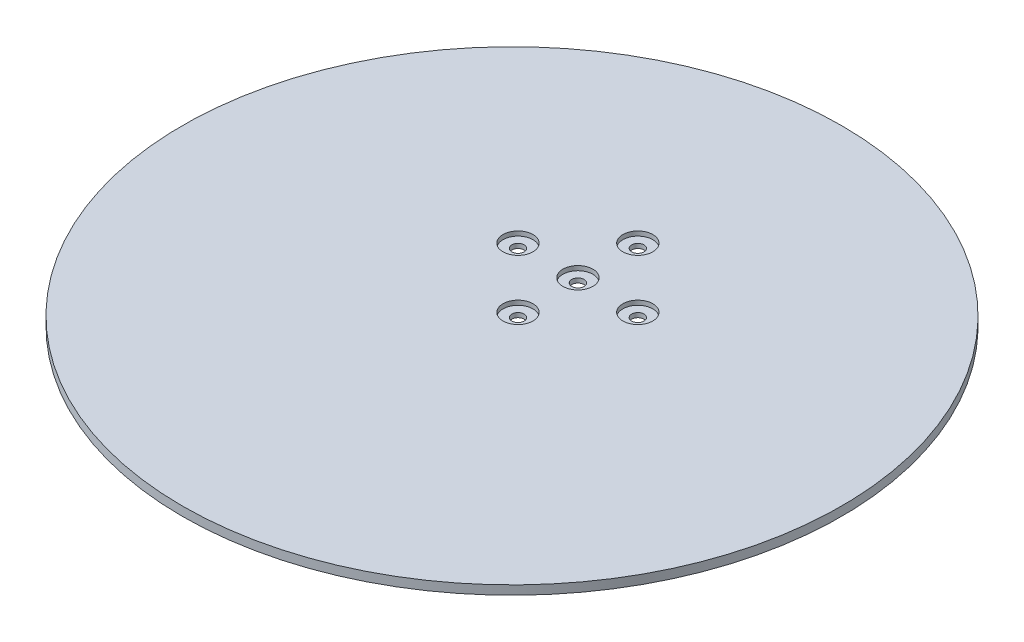
ISO-10303-21;
HEADER;
FILE_DESCRIPTION(('STEP AP214'),'2;1');
FILE_NAME('part.step','',(''),(''),'','','');
FILE_SCHEMA(('AUTOMOTIVE_DESIGN { 1 0 10303 214 1 1 1 1 }'));
ENDSEC;
DATA;
#1=APPLICATION_CONTEXT('core data for automotive mechanical design processes');
#2=APPLICATION_PROTOCOL_DEFINITION('international standard','automotive_design',2000,#1);
#3=PRODUCT_CONTEXT('',#1,'mechanical');
#4=PRODUCT('Part','Part','',(#3));
#5=PRODUCT_RELATED_PRODUCT_CATEGORY('part','',(#4));
#6=PRODUCT_DEFINITION_FORMATION('','',#4);
#7=PRODUCT_DEFINITION_CONTEXT('part definition',#1,'design');
#8=PRODUCT_DEFINITION('design','',#6,#7);
#9=PRODUCT_DEFINITION_SHAPE('','',#8);
#10=(LENGTH_UNIT() NAMED_UNIT(*) SI_UNIT(.MILLI.,.METRE.));
#11=(NAMED_UNIT(*) PLANE_ANGLE_UNIT() SI_UNIT($,.RADIAN.));
#12=(NAMED_UNIT(*) SI_UNIT($,.STERADIAN.) SOLID_ANGLE_UNIT());
#13=UNCERTAINTY_MEASURE_WITH_UNIT(LENGTH_MEASURE(1.E-05),#10,'distance_accuracy_value','');
#14=(GEOMETRIC_REPRESENTATION_CONTEXT(3) GLOBAL_UNCERTAINTY_ASSIGNED_CONTEXT((#13)) GLOBAL_UNIT_ASSIGNED_CONTEXT((#10,
#11,#12)) REPRESENTATION_CONTEXT('',''));
#15=CARTESIAN_POINT('',(0.,0.,0.));
#16=DIRECTION('',(0.,0.,1.));
#17=DIRECTION('',(1.,0.,0.));
#18=AXIS2_PLACEMENT_3D('',#15,#16,#17);
#19=CARTESIAN_POINT('',(-1.61653377487451E-13,0.,-22.));
#20=DIRECTION('',(0.,1.,0.));
#21=DIRECTION('',(0.,0.,1.));
#22=AXIS2_PLACEMENT_3D('',#19,#20,#21);
#23=CYLINDRICAL_SURFACE('',#22,2.04999999999999);
#24=CARTESIAN_POINT('',(-1.61653377487451E-13,0.,-22.));
#25=DIRECTION('',(0.,1.,0.));
#26=DIRECTION('',(0.,0.,1.));
#27=AXIS2_PLACEMENT_3D('',#24,#25,#26);
#28=CIRCLE('',#27,2.04999999999999);
#29=CARTESIAN_POINT('',(-1.61653377487451E-13,0.,-19.95));
#30=VERTEX_POINT('',#29);
#31=EDGE_CURVE('E52',#30,#30,#28,.T.);
#32=ORIENTED_EDGE('',*,*,#31,.F.);
#33=EDGE_LOOP('',(#32));
#34=FACE_BOUND('',#33,.T.);
#35=CARTESIAN_POINT('',(-1.61653377487451E-13,1.5,-22.));
#36=DIRECTION('',(0.,1.,0.));
#37=DIRECTION('',(0.,0.,1.));
#38=AXIS2_PLACEMENT_3D('',#35,#36,#37);
#39=CIRCLE('',#38,2.04999999999999);
#40=CARTESIAN_POINT('',(-1.61653377487451E-13,1.5,-19.95));
#41=VERTEX_POINT('',#40);
#42=EDGE_CURVE('E41',#41,#41,#39,.F.);
#43=ORIENTED_EDGE('',*,*,#42,.F.);
#44=EDGE_LOOP('',(#43));
#45=FACE_BOUND('',#44,.T.);
#46=ADVANCED_FACE('F37',(#34,#45),#23,.F.);
#47=CARTESIAN_POINT('',(-20.0000000000002,0.,-22.));
#48=DIRECTION('',(0.,1.,0.));
#49=DIRECTION('',(0.,0.,1.));
#50=AXIS2_PLACEMENT_3D('',#47,#48,#49);
#51=CYLINDRICAL_SURFACE('',#50,2.05000000000001);
#52=CARTESIAN_POINT('',(-20.0000000000002,0.,-22.));
#53=DIRECTION('',(0.,1.,0.));
#54=DIRECTION('',(0.,0.,1.));
#55=AXIS2_PLACEMENT_3D('',#52,#53,#54);
#56=CIRCLE('',#55,2.05000000000001);
#57=CARTESIAN_POINT('',(-20.0000000000002,0.,-19.95));
#58=VERTEX_POINT('',#57);
#59=EDGE_CURVE('E76',#58,#58,#56,.T.);
#60=ORIENTED_EDGE('',*,*,#59,.F.);
#61=EDGE_LOOP('',(#60));
#62=FACE_BOUND('',#61,.T.);
#63=CARTESIAN_POINT('',(-20.0000000000002,1.5,-22.));
#64=DIRECTION('',(0.,1.,0.));
#65=DIRECTION('',(0.,0.,1.));
#66=AXIS2_PLACEMENT_3D('',#63,#64,#65);
#67=CIRCLE('',#66,2.05000000000001);
#68=CARTESIAN_POINT('',(-20.0000000000002,1.5,-19.95));
#69=VERTEX_POINT('',#68);
#70=EDGE_CURVE('E69',#69,#69,#67,.F.);
#71=ORIENTED_EDGE('',*,*,#70,.F.);
#72=EDGE_LOOP('',(#71));
#73=FACE_BOUND('',#72,.T.);
#74=ADVANCED_FACE('F128',(#62,#73),#51,.F.);
#75=CARTESIAN_POINT('',(-1.53461104505471E-13,0.,-2.));
#76=DIRECTION('',(0.,1.,0.));
#77=DIRECTION('',(0.,0.,1.));
#78=AXIS2_PLACEMENT_3D('',#75,#76,#77);
#79=CYLINDRICAL_SURFACE('',#78,2.05000000000001);
#80=CARTESIAN_POINT('',(-1.53461104505471E-13,0.,-2.));
#81=DIRECTION('',(0.,1.,0.));
#82=DIRECTION('',(0.,0.,1.));
#83=AXIS2_PLACEMENT_3D('',#80,#81,#82);
#84=CIRCLE('',#83,2.05000000000001);
#85=CARTESIAN_POINT('',(-1.53461104505471E-13,0.,0.0500000000000127));
#86=VERTEX_POINT('',#85);
#87=EDGE_CURVE('E81',#86,#86,#84,.T.);
#88=ORIENTED_EDGE('',*,*,#87,.F.);
#89=EDGE_LOOP('',(#88));
#90=FACE_BOUND('',#89,.T.);
#91=CARTESIAN_POINT('',(-1.53461104505471E-13,1.5,-2.));
#92=DIRECTION('',(0.,1.,0.));
#93=DIRECTION('',(0.,0.,1.));
#94=AXIS2_PLACEMENT_3D('',#91,#92,#93);
#95=CIRCLE('',#94,2.05000000000001);
#96=CARTESIAN_POINT('',(-1.53461104505471E-13,1.5,0.0500000000000127));
#97=VERTEX_POINT('',#96);
#98=EDGE_CURVE('E66',#97,#97,#95,.F.);
#99=ORIENTED_EDGE('',*,*,#98,.F.);
#100=EDGE_LOOP('',(#99));
#101=FACE_BOUND('',#100,.T.);
#102=ADVANCED_FACE('F105',(#90,#101),#79,.F.);
#103=CARTESIAN_POINT('',(19.9999999999998,0.,-22.));
#104=DIRECTION('',(0.,1.,0.));
#105=DIRECTION('',(0.,0.,1.));
#106=AXIS2_PLACEMENT_3D('',#103,#104,#105);
#107=CYLINDRICAL_SURFACE('',#106,2.04999999999999);
#108=CARTESIAN_POINT('',(19.9999999999998,0.,-22.));
#109=DIRECTION('',(0.,1.,0.));
#110=DIRECTION('',(0.,0.,1.));
#111=AXIS2_PLACEMENT_3D('',#108,#109,#110);
#112=CIRCLE('',#111,2.04999999999999);
#113=CARTESIAN_POINT('',(19.9999999999998,0.,-19.95));
#114=VERTEX_POINT('',#113);
#115=EDGE_CURVE('E87',#114,#114,#112,.T.);
#116=ORIENTED_EDGE('',*,*,#115,.F.);
#117=EDGE_LOOP('',(#116));
#118=FACE_BOUND('',#117,.T.);
#119=CARTESIAN_POINT('',(19.9999999999998,1.5,-22.));
#120=DIRECTION('',(0.,1.,0.));
#121=DIRECTION('',(0.,0.,1.));
#122=AXIS2_PLACEMENT_3D('',#119,#120,#121);
#123=CIRCLE('',#122,2.04999999999999);
#124=CARTESIAN_POINT('',(19.9999999999998,1.5,-19.95));
#125=VERTEX_POINT('',#124);
#126=EDGE_CURVE('E61',#125,#125,#123,.F.);
#127=ORIENTED_EDGE('',*,*,#126,.F.);
#128=EDGE_LOOP('',(#127));
#129=FACE_BOUND('',#128,.T.);
#130=ADVANCED_FACE('F101',(#118,#129),#107,.F.);
#131=CARTESIAN_POINT('',(-1.59204083889156E-13,0.,-42.));
#132=DIRECTION('',(0.,1.,0.));
#133=DIRECTION('',(0.,0.,1.));
#134=AXIS2_PLACEMENT_3D('',#131,#132,#133);
#135=CYLINDRICAL_SURFACE('',#134,2.04999999999999);
#136=CARTESIAN_POINT('',(-1.59204083889156E-13,0.,-42.));
#137=DIRECTION('',(0.,1.,0.));
#138=DIRECTION('',(0.,0.,1.));
#139=AXIS2_PLACEMENT_3D('',#136,#137,#138);
#140=CIRCLE('',#139,2.04999999999999);
#141=CARTESIAN_POINT('',(-1.59204083889156E-13,0.,-39.95));
#142=VERTEX_POINT('',#141);
#143=EDGE_CURVE('E91',#142,#142,#140,.T.);
#144=ORIENTED_EDGE('',*,*,#143,.F.);
#145=EDGE_LOOP('',(#144));
#146=FACE_BOUND('',#145,.T.);
#147=CARTESIAN_POINT('',(-1.59204083889156E-13,1.5,-42.));
#148=DIRECTION('',(0.,1.,0.));
#149=DIRECTION('',(0.,0.,1.));
#150=AXIS2_PLACEMENT_3D('',#147,#148,#149);
#151=CIRCLE('',#150,2.04999999999999);
#152=CARTESIAN_POINT('',(-1.59204083889156E-13,1.5,-39.95));
#153=VERTEX_POINT('',#152);
#154=EDGE_CURVE('E57',#153,#153,#151,.F.);
#155=ORIENTED_EDGE('',*,*,#154,.F.);
#156=EDGE_LOOP('',(#155));
#157=FACE_BOUND('',#156,.T.);
#158=ADVANCED_FACE('F104',(#146,#157),#135,.F.);
#159=CARTESIAN_POINT('',(0.,3.,0.));
#160=DIRECTION('',(0.,-1.,0.));
#161=DIRECTION('',(0.,0.,-1.));
#162=AXIS2_PLACEMENT_3D('',#159,#160,#161);
#163=CYLINDRICAL_SURFACE('',#162,110.);
#164=CARTESIAN_POINT('',(0.,3.,0.));
#165=DIRECTION('',(0.,1.,0.));
#166=DIRECTION('',(0.,0.,1.));
#167=AXIS2_PLACEMENT_3D('',#164,#165,#166);
#168=CIRCLE('',#167,110.);
#169=CARTESIAN_POINT('',(0.,3.,110.));
#170=VERTEX_POINT('',#169);
#171=EDGE_CURVE('E10',#170,#170,#168,.T.);
#172=ORIENTED_EDGE('',*,*,#171,.F.);
#173=EDGE_LOOP('',(#172));
#174=FACE_BOUND('',#173,.T.);
#175=CARTESIAN_POINT('',(0.,0.,0.));
#176=DIRECTION('',(0.,1.,0.));
#177=DIRECTION('',(0.,0.,1.));
#178=AXIS2_PLACEMENT_3D('',#175,#176,#177);
#179=CIRCLE('',#178,110.);
#180=CARTESIAN_POINT('',(0.,0.,110.));
#181=VERTEX_POINT('',#180);
#182=EDGE_CURVE('E46',#181,#181,#179,.T.);
#183=ORIENTED_EDGE('',*,*,#182,.T.);
#184=EDGE_LOOP('',(#183));
#185=FACE_BOUND('',#184,.T.);
#186=ADVANCED_FACE('F39',(#174,#185),#163,.T.);
#187=CARTESIAN_POINT('',(0.,3.,0.));
#188=DIRECTION('',(0.,1.,0.));
#189=DIRECTION('',(0.,0.,1.));
#190=AXIS2_PLACEMENT_3D('',#187,#188,#189);
#191=PLANE('',#190);
#192=CARTESIAN_POINT('',(19.9999999999998,3.,-22.));
#193=DIRECTION('',(0.,1.,0.));
#194=DIRECTION('',(0.,0.,1.));
#195=AXIS2_PLACEMENT_3D('',#192,#193,#194);
#196=CIRCLE('',#195,5.);
#197=CARTESIAN_POINT('',(19.9999999999998,3.,-17.));
#198=VERTEX_POINT('',#197);
#199=EDGE_CURVE('E195',#198,#198,#196,.T.);
#200=ORIENTED_EDGE('',*,*,#199,.F.);
#201=EDGE_LOOP('',(#200));
#202=FACE_BOUND('',#201,.T.);
#203=CARTESIAN_POINT('',(-1.59204083889156E-13,3.,-42.));
#204=DIRECTION('',(0.,1.,0.));
#205=DIRECTION('',(0.,0.,1.));
#206=AXIS2_PLACEMENT_3D('',#203,#204,#205);
#207=CIRCLE('',#206,5.00000000000001);
#208=CARTESIAN_POINT('',(-1.59204083889156E-13,3.,-37.));
#209=VERTEX_POINT('',#208);
#210=EDGE_CURVE('E186',#209,#209,#207,.T.);
#211=ORIENTED_EDGE('',*,*,#210,.F.);
#212=EDGE_LOOP('',(#211));
#213=FACE_BOUND('',#212,.T.);
#214=CARTESIAN_POINT('',(-1.53461104505471E-13,3.,-2.));
#215=DIRECTION('',(0.,1.,0.));
#216=DIRECTION('',(0.,0.,1.));
#217=AXIS2_PLACEMENT_3D('',#214,#215,#216);
#218=CIRCLE('',#217,5.00000000000001);
#219=CARTESIAN_POINT('',(-1.53461104505471E-13,3.,3.00000000000001));
#220=VERTEX_POINT('',#219);
#221=EDGE_CURVE('E209',#220,#220,#218,.T.);
#222=ORIENTED_EDGE('',*,*,#221,.F.);
#223=EDGE_LOOP('',(#222));
#224=FACE_BOUND('',#223,.T.);
#225=CARTESIAN_POINT('',(-20.0000000000002,3.,-22.));
#226=DIRECTION('',(0.,1.,0.));
#227=DIRECTION('',(0.,0.,1.));
#228=AXIS2_PLACEMENT_3D('',#225,#226,#227);
#229=CIRCLE('',#228,5.);
#230=CARTESIAN_POINT('',(-20.0000000000002,3.,-17.));
#231=VERTEX_POINT('',#230);
#232=EDGE_CURVE('E201',#231,#231,#229,.T.);
#233=ORIENTED_EDGE('',*,*,#232,.F.);
#234=EDGE_LOOP('',(#233));
#235=FACE_BOUND('',#234,.T.);
#236=CARTESIAN_POINT('',(-1.61653377487451E-13,3.,-22.));
#237=DIRECTION('',(0.,1.,0.));
#238=DIRECTION('',(0.,0.,1.));
#239=AXIS2_PLACEMENT_3D('',#236,#237,#238);
#240=CIRCLE('',#239,5.00000000000001);
#241=CARTESIAN_POINT('',(-1.61653377487451E-13,3.,-17.));
#242=VERTEX_POINT('',#241);
#243=EDGE_CURVE('E180',#242,#242,#240,.T.);
#244=ORIENTED_EDGE('',*,*,#243,.F.);
#245=EDGE_LOOP('',(#244));
#246=FACE_BOUND('',#245,.T.);
#247=ORIENTED_EDGE('',*,*,#171,.T.);
#248=EDGE_LOOP('',(#247));
#249=FACE_BOUND('',#248,.T.);
#250=ADVANCED_FACE('F140',(#202,#213,#224,#235,#246,#249),#191,.T.);
#251=CARTESIAN_POINT('',(0.,0.,0.));
#252=DIRECTION('',(0.,1.,0.));
#253=DIRECTION('',(0.,0.,1.));
#254=AXIS2_PLACEMENT_3D('',#251,#252,#253);
#255=PLANE('',#254);
#256=ORIENTED_EDGE('',*,*,#143,.T.);
#257=EDGE_LOOP('',(#256));
#258=FACE_BOUND('',#257,.T.);
#259=ORIENTED_EDGE('',*,*,#115,.T.);
#260=EDGE_LOOP('',(#259));
#261=FACE_BOUND('',#260,.T.);
#262=ORIENTED_EDGE('',*,*,#87,.T.);
#263=EDGE_LOOP('',(#262));
#264=FACE_BOUND('',#263,.T.);
#265=ORIENTED_EDGE('',*,*,#59,.T.);
#266=EDGE_LOOP('',(#265));
#267=FACE_BOUND('',#266,.T.);
#268=ORIENTED_EDGE('',*,*,#31,.T.);
#269=EDGE_LOOP('',(#268));
#270=FACE_BOUND('',#269,.T.);
#271=ORIENTED_EDGE('',*,*,#182,.F.);
#272=EDGE_LOOP('',(#271));
#273=FACE_BOUND('',#272,.T.);
#274=ADVANCED_FACE('F98',(#258,#261,#264,#267,#270,#273),#255,.F.);
#275=CARTESIAN_POINT('',(-1.59204083889156E-13,1.5,-42.));
#276=DIRECTION('',(0.,1.,0.));
#277=DIRECTION('',(0.,0.,1.));
#278=AXIS2_PLACEMENT_3D('',#275,#276,#277);
#279=PLANE('',#278);
#280=CARTESIAN_POINT('',(-1.59204083889156E-13,1.5,-42.));
#281=DIRECTION('',(0.,1.,0.));
#282=DIRECTION('',(0.,0.,1.));
#283=AXIS2_PLACEMENT_3D('',#280,#281,#282);
#284=CIRCLE('',#283,5.00000000000001);
#285=CARTESIAN_POINT('',(-1.59204083889156E-13,1.5,-37.));
#286=VERTEX_POINT('',#285);
#287=EDGE_CURVE('E190',#286,#286,#284,.T.);
#288=ORIENTED_EDGE('',*,*,#287,.T.);
#289=EDGE_LOOP('',(#288));
#290=FACE_BOUND('',#289,.T.);
#291=ORIENTED_EDGE('',*,*,#154,.T.);
#292=EDGE_LOOP('',(#291));
#293=FACE_BOUND('',#292,.T.);
#294=ADVANCED_FACE('F122',(#290,#293),#279,.T.);
#295=CARTESIAN_POINT('',(-1.59204083889156E-13,1.5,-42.));
#296=DIRECTION('',(0.,1.,0.));
#297=DIRECTION('',(0.,0.,1.));
#298=AXIS2_PLACEMENT_3D('',#295,#296,#297);
#299=CYLINDRICAL_SURFACE('',#298,5.00000000000001);
#300=ORIENTED_EDGE('',*,*,#287,.F.);
#301=EDGE_LOOP('',(#300));
#302=FACE_BOUND('',#301,.T.);
#303=ORIENTED_EDGE('',*,*,#210,.T.);
#304=EDGE_LOOP('',(#303));
#305=FACE_BOUND('',#304,.T.);
#306=ADVANCED_FACE('F112',(#302,#305),#299,.F.);
#307=CARTESIAN_POINT('',(19.9999999999998,1.5,-22.));
#308=DIRECTION('',(0.,1.,0.));
#309=DIRECTION('',(0.,0.,1.));
#310=AXIS2_PLACEMENT_3D('',#307,#308,#309);
#311=PLANE('',#310);
#312=CARTESIAN_POINT('',(19.9999999999998,1.5,-22.));
#313=DIRECTION('',(0.,1.,0.));
#314=DIRECTION('',(0.,0.,1.));
#315=AXIS2_PLACEMENT_3D('',#312,#313,#314);
#316=CIRCLE('',#315,5.);
#317=CARTESIAN_POINT('',(19.9999999999998,1.5,-17.));
#318=VERTEX_POINT('',#317);
#319=EDGE_CURVE('E184',#318,#318,#316,.T.);
#320=ORIENTED_EDGE('',*,*,#319,.T.);
#321=EDGE_LOOP('',(#320));
#322=FACE_BOUND('',#321,.T.);
#323=ORIENTED_EDGE('',*,*,#126,.T.);
#324=EDGE_LOOP('',(#323));
#325=FACE_BOUND('',#324,.T.);
#326=ADVANCED_FACE('F109',(#322,#325),#311,.T.);
#327=CARTESIAN_POINT('',(19.9999999999998,1.5,-22.));
#328=DIRECTION('',(0.,1.,0.));
#329=DIRECTION('',(0.,0.,1.));
#330=AXIS2_PLACEMENT_3D('',#327,#328,#329);
#331=CYLINDRICAL_SURFACE('',#330,5.);
#332=ORIENTED_EDGE('',*,*,#319,.F.);
#333=EDGE_LOOP('',(#332));
#334=FACE_BOUND('',#333,.T.);
#335=ORIENTED_EDGE('',*,*,#199,.T.);
#336=EDGE_LOOP('',(#335));
#337=FACE_BOUND('',#336,.T.);
#338=ADVANCED_FACE('F111',(#334,#337),#331,.F.);
#339=CARTESIAN_POINT('',(-1.53461104505471E-13,1.5,-2.));
#340=DIRECTION('',(0.,1.,0.));
#341=DIRECTION('',(0.,0.,1.));
#342=AXIS2_PLACEMENT_3D('',#339,#340,#341);
#343=PLANE('',#342);
#344=CARTESIAN_POINT('',(-1.53461104505471E-13,1.5,-2.));
#345=DIRECTION('',(0.,1.,0.));
#346=DIRECTION('',(0.,0.,1.));
#347=AXIS2_PLACEMENT_3D('',#344,#345,#346);
#348=CIRCLE('',#347,5.00000000000001);
#349=CARTESIAN_POINT('',(-1.53461104505471E-13,1.5,3.00000000000001));
#350=VERTEX_POINT('',#349);
#351=EDGE_CURVE('E191',#350,#350,#348,.T.);
#352=ORIENTED_EDGE('',*,*,#351,.T.);
#353=EDGE_LOOP('',(#352));
#354=FACE_BOUND('',#353,.T.);
#355=ORIENTED_EDGE('',*,*,#98,.T.);
#356=EDGE_LOOP('',(#355));
#357=FACE_BOUND('',#356,.T.);
#358=ADVANCED_FACE('F119',(#354,#357),#343,.T.);
#359=CARTESIAN_POINT('',(-1.53461104505471E-13,1.5,-2.));
#360=DIRECTION('',(0.,1.,0.));
#361=DIRECTION('',(0.,0.,1.));
#362=AXIS2_PLACEMENT_3D('',#359,#360,#361);
#363=CYLINDRICAL_SURFACE('',#362,5.00000000000001);
#364=ORIENTED_EDGE('',*,*,#351,.F.);
#365=EDGE_LOOP('',(#364));
#366=FACE_BOUND('',#365,.T.);
#367=ORIENTED_EDGE('',*,*,#221,.T.);
#368=EDGE_LOOP('',(#367));
#369=FACE_BOUND('',#368,.T.);
#370=ADVANCED_FACE('F219',(#366,#369),#363,.F.);
#371=CARTESIAN_POINT('',(-20.0000000000002,1.5,-22.));
#372=DIRECTION('',(0.,1.,0.));
#373=DIRECTION('',(0.,0.,1.));
#374=AXIS2_PLACEMENT_3D('',#371,#372,#373);
#375=PLANE('',#374);
#376=CARTESIAN_POINT('',(-20.0000000000002,1.5,-22.));
#377=DIRECTION('',(0.,1.,0.));
#378=DIRECTION('',(0.,0.,1.));
#379=AXIS2_PLACEMENT_3D('',#376,#377,#378);
#380=CIRCLE('',#379,5.);
#381=CARTESIAN_POINT('',(-20.0000000000002,1.5,-17.));
#382=VERTEX_POINT('',#381);
#383=EDGE_CURVE('E205',#382,#382,#380,.T.);
#384=ORIENTED_EDGE('',*,*,#383,.T.);
#385=EDGE_LOOP('',(#384));
#386=FACE_BOUND('',#385,.T.);
#387=ORIENTED_EDGE('',*,*,#70,.T.);
#388=EDGE_LOOP('',(#387));
#389=FACE_BOUND('',#388,.T.);
#390=ADVANCED_FACE('F175',(#386,#389),#375,.T.);
#391=CARTESIAN_POINT('',(-20.0000000000002,1.5,-22.));
#392=DIRECTION('',(0.,1.,0.));
#393=DIRECTION('',(0.,0.,1.));
#394=AXIS2_PLACEMENT_3D('',#391,#392,#393);
#395=CYLINDRICAL_SURFACE('',#394,5.);
#396=ORIENTED_EDGE('',*,*,#383,.F.);
#397=EDGE_LOOP('',(#396));
#398=FACE_BOUND('',#397,.T.);
#399=ORIENTED_EDGE('',*,*,#232,.T.);
#400=EDGE_LOOP('',(#399));
#401=FACE_BOUND('',#400,.T.);
#402=ADVANCED_FACE('F170',(#398,#401),#395,.F.);
#403=CARTESIAN_POINT('',(-1.61653377487451E-13,1.5,-22.));
#404=DIRECTION('',(0.,1.,0.));
#405=DIRECTION('',(0.,0.,1.));
#406=AXIS2_PLACEMENT_3D('',#403,#404,#405);
#407=PLANE('',#406);
#408=CARTESIAN_POINT('',(-1.61653377487451E-13,1.5,-22.));
#409=DIRECTION('',(0.,1.,0.));
#410=DIRECTION('',(0.,0.,1.));
#411=AXIS2_PLACEMENT_3D('',#408,#409,#410);
#412=CIRCLE('',#411,5.00000000000001);
#413=CARTESIAN_POINT('',(-1.61653377487451E-13,1.5,-17.));
#414=VERTEX_POINT('',#413);
#415=EDGE_CURVE('E62',#414,#414,#412,.T.);
#416=ORIENTED_EDGE('',*,*,#415,.T.);
#417=EDGE_LOOP('',(#416));
#418=FACE_BOUND('',#417,.T.);
#419=ORIENTED_EDGE('',*,*,#42,.T.);
#420=EDGE_LOOP('',(#419));
#421=FACE_BOUND('',#420,.T.);
#422=ADVANCED_FACE('F167',(#418,#421),#407,.T.);
#423=CARTESIAN_POINT('',(-1.61653377487451E-13,1.5,-22.));
#424=DIRECTION('',(0.,1.,0.));
#425=DIRECTION('',(0.,0.,1.));
#426=AXIS2_PLACEMENT_3D('',#423,#424,#425);
#427=CYLINDRICAL_SURFACE('',#426,5.00000000000001);
#428=ORIENTED_EDGE('',*,*,#415,.F.);
#429=EDGE_LOOP('',(#428));
#430=FACE_BOUND('',#429,.T.);
#431=ORIENTED_EDGE('',*,*,#243,.T.);
#432=EDGE_LOOP('',(#431));
#433=FACE_BOUND('',#432,.T.);
#434=ADVANCED_FACE('F164',(#430,#433),#427,.F.);
#435=CLOSED_SHELL('',(#46,#74,#102,#130,#158,#186,#250,#274,#294,#306,#326,#338,#358,#370,#390,
#402,#422,#434));
#436=MANIFOLD_SOLID_BREP('B2',#435);
#437=ADVANCED_BREP_SHAPE_REPRESENTATION('',(#18,#436),#14);
#438=SHAPE_DEFINITION_REPRESENTATION(#9,#437);
ENDSEC;
END-ISO-10303-21;
